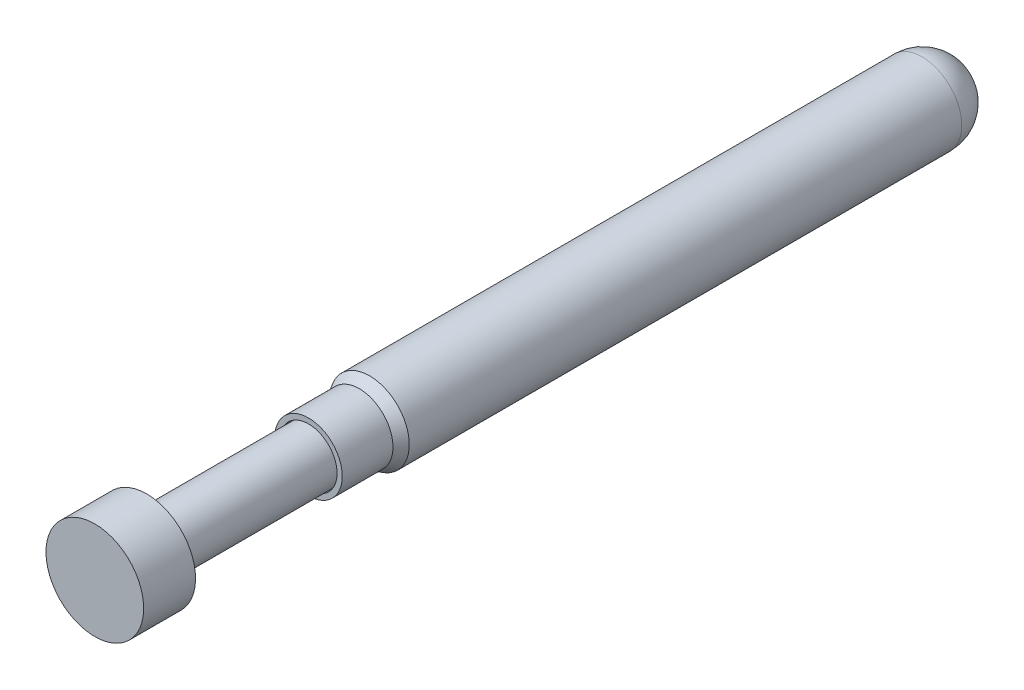
ISO-10303-21;
HEADER;
FILE_DESCRIPTION(('STEP AP214'),'2;1');
FILE_NAME('part.step','',(''),(''),'','','');
FILE_SCHEMA(('AUTOMOTIVE_DESIGN { 1 0 10303 214 1 1 1 1 }'));
ENDSEC;
DATA;
#1=APPLICATION_CONTEXT('core data for automotive mechanical design processes');
#2=APPLICATION_PROTOCOL_DEFINITION('international standard','automotive_design',2000,#1);
#3=PRODUCT_CONTEXT('',#1,'mechanical');
#4=PRODUCT('Part','Part','',(#3));
#5=PRODUCT_RELATED_PRODUCT_CATEGORY('part','',(#4));
#6=PRODUCT_DEFINITION_FORMATION('','',#4);
#7=PRODUCT_DEFINITION_CONTEXT('part definition',#1,'design');
#8=PRODUCT_DEFINITION('design','',#6,#7);
#9=PRODUCT_DEFINITION_SHAPE('','',#8);
#10=(LENGTH_UNIT() NAMED_UNIT(*) SI_UNIT(.MILLI.,.METRE.));
#11=(NAMED_UNIT(*) PLANE_ANGLE_UNIT() SI_UNIT($,.RADIAN.));
#12=(NAMED_UNIT(*) SI_UNIT($,.STERADIAN.) SOLID_ANGLE_UNIT());
#13=UNCERTAINTY_MEASURE_WITH_UNIT(LENGTH_MEASURE(1.E-05),#10,'distance_accuracy_value','');
#14=(GEOMETRIC_REPRESENTATION_CONTEXT(3) GLOBAL_UNCERTAINTY_ASSIGNED_CONTEXT((#13)) GLOBAL_UNIT_ASSIGNED_CONTEXT((#10,
#11,#12)) REPRESENTATION_CONTEXT('',''));
#15=CARTESIAN_POINT('',(0.,0.,0.));
#16=DIRECTION('',(0.,0.,1.));
#17=DIRECTION('',(1.,0.,0.));
#18=AXIS2_PLACEMENT_3D('',#15,#16,#17);
#19=CARTESIAN_POINT('',(0.,0.,18.034));
#20=DIRECTION('',(0.,0.,-1.));
#21=DIRECTION('',(0.,1.,0.));
#22=AXIS2_PLACEMENT_3D('',#19,#20,#21);
#23=PLANE('',#22);
#24=CARTESIAN_POINT('',(0.,0.,18.034));
#25=DIRECTION('',(0.,0.,-1.));
#26=DIRECTION('',(0.,1.,0.));
#27=AXIS2_PLACEMENT_3D('',#24,#25,#26);
#28=CIRCLE('',#27,2.03199999999998);
#29=CARTESIAN_POINT('',(0.,2.032,18.034));
#30=VERTEX_POINT('',#29);
#31=EDGE_CURVE('E61',#30,#30,#28,.T.);
#32=ORIENTED_EDGE('',*,*,#31,.F.);
#33=EDGE_LOOP('',(#32));
#34=FACE_BOUND('',#33,.T.);
#35=ADVANCED_FACE('F47',(#34),#23,.F.);
#36=CARTESIAN_POINT('',(0.,0.,2.794));
#37=DIRECTION('',(0.,0.,1.));
#38=DIRECTION('',(0.,-1.,0.));
#39=AXIS2_PLACEMENT_3D('',#36,#37,#38);
#40=PLANE('',#39);
#41=CARTESIAN_POINT('',(0.,0.,2.794));
#42=DIRECTION('',(0.,0.,-1.));
#43=DIRECTION('',(0.,1.,0.));
#44=AXIS2_PLACEMENT_3D('',#41,#42,#43);
#45=CIRCLE('',#44,1.15569999999999);
#46=CARTESIAN_POINT('',(0.,1.1557,2.794));
#47=VERTEX_POINT('',#46);
#48=EDGE_CURVE('E11',#47,#47,#45,.T.);
#49=ORIENTED_EDGE('',*,*,#48,.T.);
#50=EDGE_LOOP('',(#49));
#51=FACE_BOUND('',#50,.T.);
#52=ADVANCED_FACE('F70',(#51),#40,.F.);
#53=CARTESIAN_POINT('',(0.,0.,0.));
#54=DIRECTION('',(0.,0.,-1.));
#55=DIRECTION('',(0.,1.,0.));
#56=AXIS2_PLACEMENT_3D('',#53,#54,#55);
#57=CYLINDRICAL_SURFACE('',#56,1.15569999999999);
#58=ORIENTED_EDGE('',*,*,#48,.F.);
#59=EDGE_LOOP('',(#58));
#60=FACE_BOUND('',#59,.T.);
#61=CARTESIAN_POINT('',(0.,0.,15.494));
#62=DIRECTION('',(0.,0.,-1.));
#63=DIRECTION('',(0.,1.,0.));
#64=AXIS2_PLACEMENT_3D('',#61,#62,#63);
#65=CIRCLE('',#64,1.15569999999998);
#66=CARTESIAN_POINT('',(0.,1.1557,15.494));
#67=VERTEX_POINT('',#66);
#68=EDGE_CURVE('E53',#67,#67,#65,.T.);
#69=ORIENTED_EDGE('',*,*,#68,.T.);
#70=EDGE_LOOP('',(#69));
#71=FACE_BOUND('',#70,.T.);
#72=ADVANCED_FACE('F74',(#60,#71),#57,.T.);
#73=CARTESIAN_POINT('',(0.,0.,15.875));
#74=DIRECTION('',(0.,0.,1.));
#75=DIRECTION('',(0.,-1.,0.));
#76=AXIS2_PLACEMENT_3D('',#73,#74,#75);
#77=CONICAL_SURFACE('',#76,2.03199999999998,1.1606689862534);
#78=ORIENTED_EDGE('',*,*,#68,.F.);
#79=EDGE_LOOP('',(#78));
#80=FACE_BOUND('',#79,.T.);
#81=CARTESIAN_POINT('',(0.,0.,15.875));
#82=DIRECTION('',(0.,0.,-1.));
#83=DIRECTION('',(0.,1.,0.));
#84=AXIS2_PLACEMENT_3D('',#81,#82,#83);
#85=CIRCLE('',#84,2.03199999999998);
#86=CARTESIAN_POINT('',(0.,2.032,15.875));
#87=VERTEX_POINT('',#86);
#88=EDGE_CURVE('E57',#87,#87,#85,.T.);
#89=ORIENTED_EDGE('',*,*,#88,.T.);
#90=EDGE_LOOP('',(#89));
#91=FACE_BOUND('',#90,.T.);
#92=ADVANCED_FACE('F78',(#80,#91),#77,.T.);
#93=CARTESIAN_POINT('',(0.,0.,0.));
#94=DIRECTION('',(0.,0.,-1.));
#95=DIRECTION('',(0.,1.,0.));
#96=AXIS2_PLACEMENT_3D('',#93,#94,#95);
#97=CYLINDRICAL_SURFACE('',#96,2.03199999999998);
#98=ORIENTED_EDGE('',*,*,#88,.F.);
#99=EDGE_LOOP('',(#98));
#100=FACE_BOUND('',#99,.T.);
#101=ORIENTED_EDGE('',*,*,#31,.T.);
#102=EDGE_LOOP('',(#101));
#103=FACE_BOUND('',#102,.T.);
#104=ADVANCED_FACE('F67',(#100,#103),#97,.T.);
#105=CLOSED_SHELL('',(#35,#52,#72,#92,#104));
#106=MANIFOLD_SOLID_BREP('B2',#105);
#107=CARTESIAN_POINT('',(0.,0.,-16.383));
#108=DIRECTION('',(0.,0.,-1.));
#109=DIRECTION('',(0.,1.,0.));
#110=AXIS2_PLACEMENT_3D('',#107,#108,#109);
#111=SPHERICAL_SURFACE('',#110,1.651);
#112=CARTESIAN_POINT('',(0.,0.,-16.383));
#113=DIRECTION('',(0.,0.,-1.));
#114=DIRECTION('',(-1.,0.,0.));
#115=AXIS2_PLACEMENT_3D('',#112,#113,#114);
#116=CIRCLE('',#115,1.65099999999999);
#117=CARTESIAN_POINT('',(-1.65099999999999,0.,-16.383));
#118=VERTEX_POINT('',#117);
#119=EDGE_CURVE('E46',#118,#118,#116,.T.);
#120=ORIENTED_EDGE('',*,*,#119,.T.);
#121=EDGE_LOOP('',(#120));
#122=FACE_BOUND('',#121,.T.);
#123=ADVANCED_FACE('F121',(#122),#111,.T.);
#124=CARTESIAN_POINT('',(0.,0.,-18.034));
#125=DIRECTION('',(0.,0.,-1.));
#126=DIRECTION('',(-1.,0.,0.));
#127=AXIS2_PLACEMENT_3D('',#124,#125,#126);
#128=CYLINDRICAL_SURFACE('',#127,1.65099999999999);
#129=CARTESIAN_POINT('',(0.,0.,6.604));
#130=DIRECTION('',(0.,0.,-1.));
#131=DIRECTION('',(-1.,0.,0.));
#132=AXIS2_PLACEMENT_3D('',#129,#130,#131);
#133=CIRCLE('',#132,1.65099999999999);
#134=CARTESIAN_POINT('',(-1.65099999999999,0.,6.604));
#135=VERTEX_POINT('',#134);
#136=EDGE_CURVE('E127',#135,#135,#133,.T.);
#137=ORIENTED_EDGE('',*,*,#136,.T.);
#138=EDGE_LOOP('',(#137));
#139=FACE_BOUND('',#138,.T.);
#140=ORIENTED_EDGE('',*,*,#119,.F.);
#141=EDGE_LOOP('',(#140));
#142=FACE_BOUND('',#141,.T.);
#143=ADVANCED_FACE('F170',(#139,#142),#128,.T.);
#144=CARTESIAN_POINT('',(0.,0.,6.604));
#145=DIRECTION('',(0.,0.,-1.));
#146=DIRECTION('',(-1.,0.,0.));
#147=AXIS2_PLACEMENT_3D('',#144,#145,#146);
#148=CONICAL_SURFACE('',#147,1.65099999999999,0.523598775598293);
#149=CARTESIAN_POINT('',(0.,0.,7.03294238249444));
#150=DIRECTION('',(0.,0.,-1.));
#151=DIRECTION('',(-1.,0.,0.));
#152=AXIS2_PLACEMENT_3D('',#149,#150,#151);
#153=CIRCLE('',#152,1.40334999999999);
#154=CARTESIAN_POINT('',(-1.40334999999999,0.,7.03294238249444));
#155=VERTEX_POINT('',#154);
#156=EDGE_CURVE('E131',#155,#155,#153,.T.);
#157=ORIENTED_EDGE('',*,*,#156,.T.);
#158=EDGE_LOOP('',(#157));
#159=FACE_BOUND('',#158,.T.);
#160=ORIENTED_EDGE('',*,*,#136,.F.);
#161=EDGE_LOOP('',(#160));
#162=FACE_BOUND('',#161,.T.);
#163=ADVANCED_FACE('F164',(#159,#162),#148,.T.);
#164=CARTESIAN_POINT('',(0.,0.,-18.034));
#165=DIRECTION('',(0.,0.,-1.));
#166=DIRECTION('',(-1.,0.,0.));
#167=AXIS2_PLACEMENT_3D('',#164,#165,#166);
#168=CYLINDRICAL_SURFACE('',#167,1.40334999999999);
#169=CARTESIAN_POINT('',(0.,0.,9.144));
#170=DIRECTION('',(0.,0.,-1.));
#171=DIRECTION('',(-1.,0.,0.));
#172=AXIS2_PLACEMENT_3D('',#169,#170,#171);
#173=CIRCLE('',#172,1.40334999999999);
#174=CARTESIAN_POINT('',(-1.40334999999999,0.,9.144));
#175=VERTEX_POINT('',#174);
#176=EDGE_CURVE('E135',#175,#175,#173,.T.);
#177=ORIENTED_EDGE('',*,*,#176,.T.);
#178=EDGE_LOOP('',(#177));
#179=FACE_BOUND('',#178,.T.);
#180=ORIENTED_EDGE('',*,*,#156,.F.);
#181=EDGE_LOOP('',(#180));
#182=FACE_BOUND('',#181,.T.);
#183=ADVANCED_FACE('F158',(#179,#182),#168,.T.);
#184=CARTESIAN_POINT('',(0.,0.,9.144));
#185=DIRECTION('',(0.,0.,1.));
#186=DIRECTION('',(1.,0.,0.));
#187=AXIS2_PLACEMENT_3D('',#184,#185,#186);
#188=PLANE('',#187);
#189=CARTESIAN_POINT('',(0.,0.,9.144));
#190=DIRECTION('',(0.,0.,1.));
#191=DIRECTION('',(1.,0.,0.));
#192=AXIS2_PLACEMENT_3D('',#189,#190,#191);
#193=CIRCLE('',#192,1.18872);
#194=CARTESIAN_POINT('',(1.18872,0.,9.144));
#195=VERTEX_POINT('',#194);
#196=EDGE_CURVE('E141',#195,#195,#193,.T.);
#197=ORIENTED_EDGE('',*,*,#196,.F.);
#198=EDGE_LOOP('',(#197));
#199=FACE_BOUND('',#198,.T.);
#200=ORIENTED_EDGE('',*,*,#176,.F.);
#201=EDGE_LOOP('',(#200));
#202=FACE_BOUND('',#201,.T.);
#203=ADVANCED_FACE('F152',(#199,#202),#188,.T.);
#204=CARTESIAN_POINT('',(0.,0.,-4.191));
#205=DIRECTION('',(0.,0.,1.));
#206=DIRECTION('',(1.,0.,0.));
#207=AXIS2_PLACEMENT_3D('',#204,#205,#206);
#208=CYLINDRICAL_SURFACE('',#207,1.18872);
#209=CARTESIAN_POINT('',(0.,0.,-4.191));
#210=DIRECTION('',(0.,0.,1.));
#211=DIRECTION('',(1.,0.,0.));
#212=AXIS2_PLACEMENT_3D('',#209,#210,#211);
#213=CIRCLE('',#212,1.18872);
#214=CARTESIAN_POINT('',(1.18872,0.,-4.191));
#215=VERTEX_POINT('',#214);
#216=EDGE_CURVE('E140',#215,#215,#213,.T.);
#217=ORIENTED_EDGE('',*,*,#216,.F.);
#218=EDGE_LOOP('',(#217));
#219=FACE_BOUND('',#218,.T.);
#220=ORIENTED_EDGE('',*,*,#196,.T.);
#221=EDGE_LOOP('',(#220));
#222=FACE_BOUND('',#221,.T.);
#223=ADVANCED_FACE('F149',(#219,#222),#208,.F.);
#224=CARTESIAN_POINT('',(0.,0.,-4.191));
#225=DIRECTION('',(0.,0.,1.));
#226=DIRECTION('',(1.,0.,0.));
#227=AXIS2_PLACEMENT_3D('',#224,#225,#226);
#228=PLANE('',#227);
#229=ORIENTED_EDGE('',*,*,#216,.T.);
#230=EDGE_LOOP('',(#229));
#231=FACE_BOUND('',#230,.T.);
#232=ADVANCED_FACE('F147',(#231),#228,.T.);
#233=CLOSED_SHELL('',(#123,#143,#163,#183,#203,#223,#232));
#234=MANIFOLD_SOLID_BREP('B6',#233);
#235=ADVANCED_BREP_SHAPE_REPRESENTATION('',(#18,#106,#234),#14);
#236=SHAPE_DEFINITION_REPRESENTATION(#9,#235);
ENDSEC;
END-ISO-10303-21;
